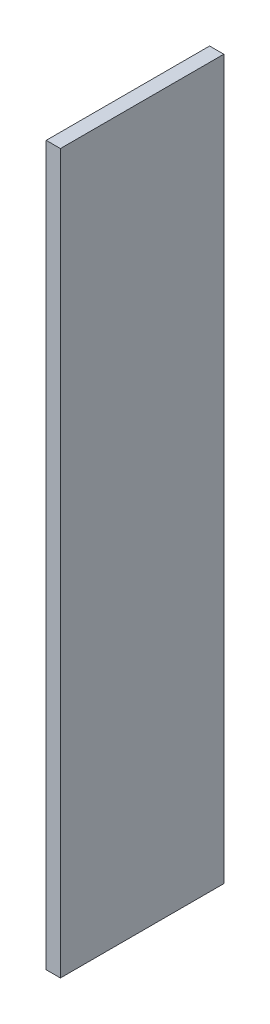
ISO-10303-21;
HEADER;
FILE_DESCRIPTION(('STEP AP214'),'2;1');
FILE_NAME('part.step','',(''),(''),'','','');
FILE_SCHEMA(('AUTOMOTIVE_DESIGN { 1 0 10303 214 1 1 1 1 }'));
ENDSEC;
DATA;
#1=APPLICATION_CONTEXT('core data for automotive mechanical design processes');
#2=APPLICATION_PROTOCOL_DEFINITION('international standard','automotive_design',2000,#1);
#3=PRODUCT_CONTEXT('',#1,'mechanical');
#4=PRODUCT('Part','Part','',(#3));
#5=PRODUCT_RELATED_PRODUCT_CATEGORY('part','',(#4));
#6=PRODUCT_DEFINITION_FORMATION('','',#4);
#7=PRODUCT_DEFINITION_CONTEXT('part definition',#1,'design');
#8=PRODUCT_DEFINITION('design','',#6,#7);
#9=PRODUCT_DEFINITION_SHAPE('','',#8);
#10=(LENGTH_UNIT() NAMED_UNIT(*) SI_UNIT(.MILLI.,.METRE.));
#11=(NAMED_UNIT(*) PLANE_ANGLE_UNIT() SI_UNIT($,.RADIAN.));
#12=(NAMED_UNIT(*) SI_UNIT($,.STERADIAN.) SOLID_ANGLE_UNIT());
#13=UNCERTAINTY_MEASURE_WITH_UNIT(LENGTH_MEASURE(1.E-05),#10,'distance_accuracy_value','');
#14=(GEOMETRIC_REPRESENTATION_CONTEXT(3) GLOBAL_UNCERTAINTY_ASSIGNED_CONTEXT((#13)) GLOBAL_UNIT_ASSIGNED_CONTEXT((#10,
#11,#12)) REPRESENTATION_CONTEXT('',''));
#15=CARTESIAN_POINT('',(0.,0.,0.));
#16=DIRECTION('',(0.,0.,1.));
#17=DIRECTION('',(1.,0.,0.));
#18=AXIS2_PLACEMENT_3D('',#15,#16,#17);
#19=CARTESIAN_POINT('',(50.7999999999999,5137.15,-584.2));
#20=DIRECTION('',(-1.,0.,0.));
#21=DIRECTION('',(0.,0.,1.));
#22=AXIS2_PLACEMENT_3D('',#19,#20,#21);
#23=PLANE('',#22);
#24=DIRECTION('',(0.,0.,-1.));
#25=VECTOR('',#24,1.);
#26=CARTESIAN_POINT('',(50.7999999999999,0.,-584.2));
#27=LINE('',#26,#25);
#28=CARTESIAN_POINT('',(50.8000000000001,0.,584.2));
#29=VERTEX_POINT('',#28);
#30=CARTESIAN_POINT('',(50.7999999999999,0.,-584.2));
#31=VERTEX_POINT('',#30);
#32=EDGE_CURVE('E97',#29,#31,#27,.T.);
#33=ORIENTED_EDGE('',*,*,#32,.T.);
#34=DIRECTION('',(0.,-1.,0.));
#35=VECTOR('',#34,1.);
#36=CARTESIAN_POINT('',(50.7999999999999,5137.15,-584.2));
#37=LINE('',#36,#35);
#38=CARTESIAN_POINT('',(50.7999999999999,5137.15,-584.2));
#39=VERTEX_POINT('',#38);
#40=EDGE_CURVE('E11',#39,#31,#37,.T.);
#41=ORIENTED_EDGE('',*,*,#40,.F.);
#42=DIRECTION('',(0.,0.,-1.));
#43=VECTOR('',#42,1.);
#44=CARTESIAN_POINT('',(50.7999999999999,5137.15,-584.2));
#45=LINE('',#44,#43);
#46=CARTESIAN_POINT('',(50.8000000000001,5137.15,584.2));
#47=VERTEX_POINT('',#46);
#48=EDGE_CURVE('E85',#47,#39,#45,.T.);
#49=ORIENTED_EDGE('',*,*,#48,.F.);
#50=DIRECTION('',(0.,-1.,0.));
#51=VECTOR('',#50,1.);
#52=CARTESIAN_POINT('',(50.8000000000001,5137.15,584.2));
#53=LINE('',#52,#51);
#54=EDGE_CURVE('E93',#47,#29,#53,.T.);
#55=ORIENTED_EDGE('',*,*,#54,.T.);
#56=EDGE_LOOP('',(#33,#41,#49,#55));
#57=FACE_BOUND('',#56,.T.);
#58=ADVANCED_FACE('F34',(#57),#23,.F.);
#59=CARTESIAN_POINT('',(-50.8000000000001,5137.15,-584.2));
#60=DIRECTION('',(0.,0.,1.));
#61=DIRECTION('',(1.,0.,0.));
#62=AXIS2_PLACEMENT_3D('',#59,#60,#61);
#63=PLANE('',#62);
#64=DIRECTION('',(-1.,0.,0.));
#65=VECTOR('',#64,1.);
#66=CARTESIAN_POINT('',(-50.8000000000001,0.,-584.2));
#67=LINE('',#66,#65);
#68=CARTESIAN_POINT('',(-50.8000000000001,0.,-584.2));
#69=VERTEX_POINT('',#68);
#70=EDGE_CURVE('E89',#31,#69,#67,.T.);
#71=ORIENTED_EDGE('',*,*,#70,.T.);
#72=DIRECTION('',(0.,-1.,0.));
#73=VECTOR('',#72,1.);
#74=CARTESIAN_POINT('',(-50.8000000000001,5137.15,-584.2));
#75=LINE('',#74,#73);
#76=CARTESIAN_POINT('',(-50.8000000000001,5137.15,-584.2));
#77=VERTEX_POINT('',#76);
#78=EDGE_CURVE('E42',#77,#69,#75,.T.);
#79=ORIENTED_EDGE('',*,*,#78,.F.);
#80=DIRECTION('',(-1.,0.,0.));
#81=VECTOR('',#80,1.);
#82=CARTESIAN_POINT('',(-50.8000000000001,5137.15,-584.2));
#83=LINE('',#82,#81);
#84=EDGE_CURVE('E80',#39,#77,#83,.T.);
#85=ORIENTED_EDGE('',*,*,#84,.F.);
#86=ORIENTED_EDGE('',*,*,#40,.T.);
#87=EDGE_LOOP('',(#71,#79,#85,#86));
#88=FACE_BOUND('',#87,.T.);
#89=ADVANCED_FACE('F88',(#88),#63,.F.);
#90=CARTESIAN_POINT('',(-50.8000000000001,5137.15,-584.2));
#91=DIRECTION('',(1.,0.,0.));
#92=DIRECTION('',(0.,0.,-1.));
#93=AXIS2_PLACEMENT_3D('',#90,#91,#92);
#94=PLANE('',#93);
#95=DIRECTION('',(0.,0.,1.));
#96=VECTOR('',#95,1.);
#97=CARTESIAN_POINT('',(-50.8000000000001,0.,-584.2));
#98=LINE('',#97,#96);
#99=CARTESIAN_POINT('',(-50.7999999999999,0.,584.2));
#100=VERTEX_POINT('',#99);
#101=EDGE_CURVE('E67',#69,#100,#98,.T.);
#102=ORIENTED_EDGE('',*,*,#101,.T.);
#103=DIRECTION('',(0.,-1.,0.));
#104=VECTOR('',#103,1.);
#105=CARTESIAN_POINT('',(-50.7999999999999,5137.15,584.2));
#106=LINE('',#105,#104);
#107=CARTESIAN_POINT('',(-50.7999999999999,5137.15,584.2));
#108=VERTEX_POINT('',#107);
#109=EDGE_CURVE('E90',#108,#100,#106,.T.);
#110=ORIENTED_EDGE('',*,*,#109,.F.);
#111=DIRECTION('',(0.,0.,1.));
#112=VECTOR('',#111,1.);
#113=CARTESIAN_POINT('',(-50.8000000000001,5137.15,-584.2));
#114=LINE('',#113,#112);
#115=EDGE_CURVE('E83',#77,#108,#114,.T.);
#116=ORIENTED_EDGE('',*,*,#115,.F.);
#117=ORIENTED_EDGE('',*,*,#78,.T.);
#118=EDGE_LOOP('',(#102,#110,#116,#117));
#119=FACE_BOUND('',#118,.T.);
#120=ADVANCED_FACE('F91',(#119),#94,.F.);
#121=CARTESIAN_POINT('',(-50.7999999999999,5137.15,584.2));
#122=DIRECTION('',(0.,0.,-1.));
#123=DIRECTION('',(-1.,0.,0.));
#124=AXIS2_PLACEMENT_3D('',#121,#122,#123);
#125=PLANE('',#124);
#126=DIRECTION('',(1.,0.,0.));
#127=VECTOR('',#126,1.);
#128=CARTESIAN_POINT('',(-50.7999999999999,0.,584.2));
#129=LINE('',#128,#127);
#130=EDGE_CURVE('E73',#100,#29,#129,.T.);
#131=ORIENTED_EDGE('',*,*,#130,.T.);
#132=ORIENTED_EDGE('',*,*,#54,.F.);
#133=DIRECTION('',(1.,0.,0.));
#134=VECTOR('',#133,1.);
#135=CARTESIAN_POINT('',(-50.7999999999999,5137.15,584.2));
#136=LINE('',#135,#134);
#137=EDGE_CURVE('E50',#108,#47,#136,.T.);
#138=ORIENTED_EDGE('',*,*,#137,.F.);
#139=ORIENTED_EDGE('',*,*,#109,.T.);
#140=EDGE_LOOP('',(#131,#132,#138,#139));
#141=FACE_BOUND('',#140,.T.);
#142=ADVANCED_FACE('F104',(#141),#125,.F.);
#143=CARTESIAN_POINT('',(0.,5137.15,0.));
#144=DIRECTION('',(0.,1.,0.));
#145=DIRECTION('',(0.,0.,1.));
#146=AXIS2_PLACEMENT_3D('',#143,#144,#145);
#147=PLANE('',#146);
#148=ORIENTED_EDGE('',*,*,#48,.T.);
#149=ORIENTED_EDGE('',*,*,#84,.T.);
#150=ORIENTED_EDGE('',*,*,#115,.T.);
#151=ORIENTED_EDGE('',*,*,#137,.T.);
#152=EDGE_LOOP('',(#148,#149,#150,#151));
#153=FACE_BOUND('',#152,.T.);
#154=ADVANCED_FACE('F81',(#153),#147,.T.);
#155=CARTESIAN_POINT('',(0.,0.,0.));
#156=DIRECTION('',(0.,1.,0.));
#157=DIRECTION('',(0.,0.,1.));
#158=AXIS2_PLACEMENT_3D('',#155,#156,#157);
#159=PLANE('',#158);
#160=ORIENTED_EDGE('',*,*,#32,.F.);
#161=ORIENTED_EDGE('',*,*,#130,.F.);
#162=ORIENTED_EDGE('',*,*,#101,.F.);
#163=ORIENTED_EDGE('',*,*,#70,.F.);
#164=EDGE_LOOP('',(#160,#161,#162,#163));
#165=FACE_BOUND('',#164,.T.);
#166=ADVANCED_FACE('F107',(#165),#159,.F.);
#167=CLOSED_SHELL('',(#58,#89,#120,#142,#154,#166));
#168=MANIFOLD_SOLID_BREP('B2',#167);
#169=ADVANCED_BREP_SHAPE_REPRESENTATION('',(#18,#168),#14);
#170=SHAPE_DEFINITION_REPRESENTATION(#9,#169);
ENDSEC;
END-ISO-10303-21;
